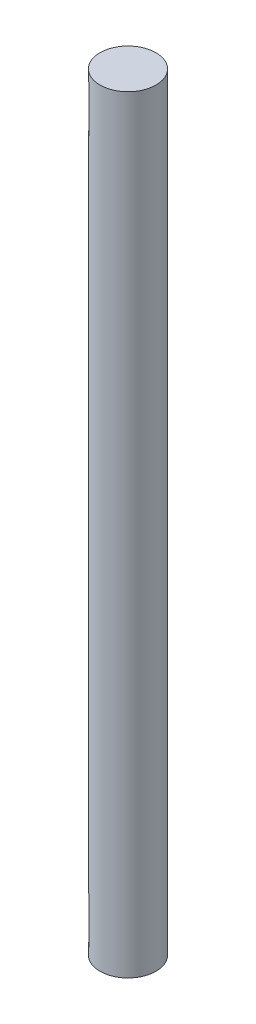
ISO-10303-21;
HEADER;
FILE_DESCRIPTION(('STEP AP214'),'2;1');
FILE_NAME('part.step','',(''),(''),'','','');
FILE_SCHEMA(('AUTOMOTIVE_DESIGN { 1 0 10303 214 1 1 1 1 }'));
ENDSEC;
DATA;
#1=APPLICATION_CONTEXT('core data for automotive mechanical design processes');
#2=APPLICATION_PROTOCOL_DEFINITION('international standard','automotive_design',2000,#1);
#3=PRODUCT_CONTEXT('',#1,'mechanical');
#4=PRODUCT('Part','Part','',(#3));
#5=PRODUCT_RELATED_PRODUCT_CATEGORY('part','',(#4));
#6=PRODUCT_DEFINITION_FORMATION('','',#4);
#7=PRODUCT_DEFINITION_CONTEXT('part definition',#1,'design');
#8=PRODUCT_DEFINITION('design','',#6,#7);
#9=PRODUCT_DEFINITION_SHAPE('','',#8);
#10=(LENGTH_UNIT() NAMED_UNIT(*) SI_UNIT(.MILLI.,.METRE.));
#11=(NAMED_UNIT(*) PLANE_ANGLE_UNIT() SI_UNIT($,.RADIAN.));
#12=(NAMED_UNIT(*) SI_UNIT($,.STERADIAN.) SOLID_ANGLE_UNIT());
#13=UNCERTAINTY_MEASURE_WITH_UNIT(LENGTH_MEASURE(1.E-05),#10,'distance_accuracy_value','');
#14=(GEOMETRIC_REPRESENTATION_CONTEXT(3) GLOBAL_UNCERTAINTY_ASSIGNED_CONTEXT((#13)) GLOBAL_UNIT_ASSIGNED_CONTEXT((#10,
#11,#12)) REPRESENTATION_CONTEXT('',''));
#15=CARTESIAN_POINT('',(0.,0.,0.));
#16=DIRECTION('',(0.,0.,1.));
#17=DIRECTION('',(1.,0.,0.));
#18=AXIS2_PLACEMENT_3D('',#15,#16,#17);
#19=CARTESIAN_POINT('',(0.,68.1,0.));
#20=DIRECTION('',(0.,-1.,0.));
#21=DIRECTION('',(0.,0.,-1.));
#22=AXIS2_PLACEMENT_3D('',#19,#20,#21);
#23=CYLINDRICAL_SURFACE('',#22,2.485);
#24=CARTESIAN_POINT('',(0.,4.95,0.));
#25=DIRECTION('',(0.,1.,0.));
#26=DIRECTION('',(0.,0.,1.));
#27=AXIS2_PLACEMENT_3D('',#24,#25,#26);
#28=CIRCLE('',#27,2.485);
#29=CARTESIAN_POINT('',(-1.435,4.95,-2.02879274446652));
#30=VERTEX_POINT('',#29);
#31=CARTESIAN_POINT('',(-1.43500000000001,4.95,2.02879274446652));
#32=VERTEX_POINT('',#31);
#33=EDGE_CURVE('E74',#30,#32,#28,.T.);
#34=ORIENTED_EDGE('',*,*,#33,.T.);
#35=DIRECTION('',(0.,-1.,0.));
#36=VECTOR('',#35,1.);
#37=CARTESIAN_POINT('',(-1.435,68.1,2.02879274446652));
#38=LINE('',#37,#36);
#39=CARTESIAN_POINT('',(-1.43500000000001,0.789999999999999,2.02879274446652));
#40=VERTEX_POINT('',#39);
#41=EDGE_CURVE('E11',#32,#40,#38,.T.);
#42=ORIENTED_EDGE('',*,*,#41,.T.);
#43=CARTESIAN_POINT('',(0.,0.789999999999999,0.));
#44=DIRECTION('',(0.,-1.,0.));
#45=DIRECTION('',(0.,0.,-1.));
#46=AXIS2_PLACEMENT_3D('',#43,#44,#45);
#47=CIRCLE('',#46,2.485);
#48=CARTESIAN_POINT('',(-1.43500000000001,0.789999999999999,-2.02879274446652));
#49=VERTEX_POINT('',#48);
#50=EDGE_CURVE('E41',#40,#49,#47,.T.);
#51=ORIENTED_EDGE('',*,*,#50,.T.);
#52=DIRECTION('',(0.,-1.,0.));
#53=VECTOR('',#52,1.);
#54=CARTESIAN_POINT('',(-1.435,68.1,-2.02879274446652));
#55=LINE('',#54,#53);
#56=EDGE_CURVE('E77',#49,#30,#55,.F.);
#57=ORIENTED_EDGE('',*,*,#56,.T.);
#58=EDGE_LOOP('',(#34,#42,#51,#57));
#59=FACE_BOUND('',#58,.T.);
#60=DIRECTION('',(0.,-1.,0.));
#61=VECTOR('',#60,1.);
#62=CARTESIAN_POINT('',(-1.43500000000001,68.1,-2.02879274446652));
#63=LINE('',#62,#61);
#64=CARTESIAN_POINT('',(-1.43500000000001,63.15,-2.02879274446652));
#65=VERTEX_POINT('',#64);
#66=CARTESIAN_POINT('',(-1.43500000000001,67.31,-2.02879274446652));
#67=VERTEX_POINT('',#66);
#68=EDGE_CURVE('E101',#65,#67,#63,.F.);
#69=ORIENTED_EDGE('',*,*,#68,.T.);
#70=CARTESIAN_POINT('',(0.,67.31,0.));
#71=DIRECTION('',(0.,1.,0.));
#72=DIRECTION('',(0.,0.,1.));
#73=AXIS2_PLACEMENT_3D('',#70,#71,#72);
#74=CIRCLE('',#73,2.485);
#75=CARTESIAN_POINT('',(-1.43500000000001,67.31,2.02879274446652));
#76=VERTEX_POINT('',#75);
#77=EDGE_CURVE('E107',#67,#76,#74,.T.);
#78=ORIENTED_EDGE('',*,*,#77,.T.);
#79=DIRECTION('',(0.,-1.,0.));
#80=VECTOR('',#79,1.);
#81=CARTESIAN_POINT('',(-1.43500000000001,68.1,2.02879274446652));
#82=LINE('',#81,#80);
#83=CARTESIAN_POINT('',(-1.43500000000001,63.15,2.02879274446652));
#84=VERTEX_POINT('',#83);
#85=EDGE_CURVE('E104',#76,#84,#82,.T.);
#86=ORIENTED_EDGE('',*,*,#85,.T.);
#87=CARTESIAN_POINT('',(0.,63.15,0.));
#88=DIRECTION('',(0.,-1.,0.));
#89=DIRECTION('',(0.,0.,-1.));
#90=AXIS2_PLACEMENT_3D('',#87,#88,#89);
#91=CIRCLE('',#90,2.485);
#92=EDGE_CURVE('E96',#84,#65,#91,.T.);
#93=ORIENTED_EDGE('',*,*,#92,.T.);
#94=EDGE_LOOP('',(#69,#78,#86,#93));
#95=FACE_BOUND('',#94,.T.);
#96=CARTESIAN_POINT('',(0.,68.1,0.));
#97=DIRECTION('',(0.,1.,0.));
#98=DIRECTION('',(0.,0.,1.));
#99=AXIS2_PLACEMENT_3D('',#96,#97,#98);
#100=CIRCLE('',#99,2.485);
#101=CARTESIAN_POINT('',(0.,68.1,2.485));
#102=VERTEX_POINT('',#101);
#103=EDGE_CURVE('E93',#102,#102,#100,.T.);
#104=ORIENTED_EDGE('',*,*,#103,.F.);
#105=EDGE_LOOP('',(#104));
#106=FACE_BOUND('',#105,.T.);
#107=CARTESIAN_POINT('',(0.,0.,0.));
#108=DIRECTION('',(0.,1.,0.));
#109=DIRECTION('',(0.,0.,1.));
#110=AXIS2_PLACEMENT_3D('',#107,#108,#109);
#111=CIRCLE('',#110,2.485);
#112=CARTESIAN_POINT('',(0.,0.,2.485));
#113=VERTEX_POINT('',#112);
#114=EDGE_CURVE('E91',#113,#113,#111,.T.);
#115=ORIENTED_EDGE('',*,*,#114,.T.);
#116=EDGE_LOOP('',(#115));
#117=FACE_BOUND('',#116,.T.);
#118=ADVANCED_FACE('F34',(#59,#95,#106,#117),#23,.T.);
#119=CARTESIAN_POINT('',(0.,68.1,0.));
#120=DIRECTION('',(0.,1.,0.));
#121=DIRECTION('',(0.,0.,1.));
#122=AXIS2_PLACEMENT_3D('',#119,#120,#121);
#123=PLANE('',#122);
#124=ORIENTED_EDGE('',*,*,#103,.T.);
#125=EDGE_LOOP('',(#124));
#126=FACE_BOUND('',#125,.T.);
#127=ADVANCED_FACE('F125',(#126),#123,.T.);
#128=CARTESIAN_POINT('',(0.,0.,0.));
#129=DIRECTION('',(0.,1.,0.));
#130=DIRECTION('',(0.,0.,1.));
#131=AXIS2_PLACEMENT_3D('',#128,#129,#130);
#132=PLANE('',#131);
#133=ORIENTED_EDGE('',*,*,#114,.F.);
#134=EDGE_LOOP('',(#133));
#135=FACE_BOUND('',#134,.T.);
#136=ADVANCED_FACE('F129',(#135),#132,.F.);
#137=CARTESIAN_POINT('',(-2.48500000000001,67.31,-2.485));
#138=DIRECTION('',(0.,1.,0.));
#139=DIRECTION('',(0.,0.,1.));
#140=AXIS2_PLACEMENT_3D('',#137,#138,#139);
#141=PLANE('',#140);
#142=DIRECTION('',(0.,0.,1.));
#143=VECTOR('',#142,1.);
#144=CARTESIAN_POINT('',(-1.43500000000001,67.31,-2.485));
#145=LINE('',#144,#143);
#146=EDGE_CURVE('E86',#67,#76,#145,.T.);
#147=ORIENTED_EDGE('',*,*,#146,.T.);
#148=ORIENTED_EDGE('',*,*,#77,.F.);
#149=EDGE_LOOP('',(#147,#148));
#150=FACE_BOUND('',#149,.T.);
#151=ADVANCED_FACE('F135',(#150),#141,.F.);
#152=CARTESIAN_POINT('',(-1.43500000000001,67.31,-2.485));
#153=DIRECTION('',(1.,0.,0.));
#154=DIRECTION('',(0.,1.,0.));
#155=AXIS2_PLACEMENT_3D('',#152,#153,#154);
#156=PLANE('',#155);
#157=ORIENTED_EDGE('',*,*,#146,.F.);
#158=ORIENTED_EDGE('',*,*,#68,.F.);
#159=DIRECTION('',(0.,0.,1.));
#160=VECTOR('',#159,1.);
#161=CARTESIAN_POINT('',(-1.43500000000001,63.15,-2.485));
#162=LINE('',#161,#160);
#163=EDGE_CURVE('E55',#65,#84,#162,.T.);
#164=ORIENTED_EDGE('',*,*,#163,.T.);
#165=ORIENTED_EDGE('',*,*,#85,.F.);
#166=EDGE_LOOP('',(#157,#158,#164,#165));
#167=FACE_BOUND('',#166,.T.);
#168=ADVANCED_FACE('F120',(#167),#156,.F.);
#169=CARTESIAN_POINT('',(-2.48500000000001,63.15,-2.485));
#170=DIRECTION('',(0.,-1.,0.));
#171=DIRECTION('',(0.,0.,-1.));
#172=AXIS2_PLACEMENT_3D('',#169,#170,#171);
#173=PLANE('',#172);
#174=ORIENTED_EDGE('',*,*,#163,.F.);
#175=ORIENTED_EDGE('',*,*,#92,.F.);
#176=EDGE_LOOP('',(#174,#175));
#177=FACE_BOUND('',#176,.T.);
#178=ADVANCED_FACE('F113',(#177),#173,.F.);
#179=CARTESIAN_POINT('',(-2.48500000000001,0.789999999999999,-2.485));
#180=DIRECTION('',(0.,-1.,0.));
#181=DIRECTION('',(0.,0.,-1.));
#182=AXIS2_PLACEMENT_3D('',#179,#180,#181);
#183=PLANE('',#182);
#184=DIRECTION('',(0.,0.,1.));
#185=VECTOR('',#184,1.);
#186=CARTESIAN_POINT('',(-1.43500000000001,0.789999999999999,-2.485));
#187=LINE('',#186,#185);
#188=EDGE_CURVE('E83',#49,#40,#187,.T.);
#189=ORIENTED_EDGE('',*,*,#188,.F.);
#190=ORIENTED_EDGE('',*,*,#50,.F.);
#191=EDGE_LOOP('',(#189,#190));
#192=FACE_BOUND('',#191,.T.);
#193=ADVANCED_FACE('F111',(#192),#183,.F.);
#194=CARTESIAN_POINT('',(-2.48500000000001,4.95,-2.485));
#195=DIRECTION('',(0.,1.,0.));
#196=DIRECTION('',(0.,0.,1.));
#197=AXIS2_PLACEMENT_3D('',#194,#195,#196);
#198=PLANE('',#197);
#199=DIRECTION('',(0.,0.,1.));
#200=VECTOR('',#199,1.);
#201=CARTESIAN_POINT('',(-1.43500000000001,4.95,-2.485));
#202=LINE('',#201,#200);
#203=EDGE_CURVE('E48',#30,#32,#202,.T.);
#204=ORIENTED_EDGE('',*,*,#203,.T.);
#205=ORIENTED_EDGE('',*,*,#33,.F.);
#206=EDGE_LOOP('',(#204,#205));
#207=FACE_BOUND('',#206,.T.);
#208=ADVANCED_FACE('F84',(#207),#198,.F.);
#209=CARTESIAN_POINT('',(-1.43500000000001,0.789999999999999,-2.485));
#210=DIRECTION('',(1.,0.,0.));
#211=DIRECTION('',(0.,1.,0.));
#212=AXIS2_PLACEMENT_3D('',#209,#210,#211);
#213=PLANE('',#212);
#214=ORIENTED_EDGE('',*,*,#203,.F.);
#215=ORIENTED_EDGE('',*,*,#56,.F.);
#216=ORIENTED_EDGE('',*,*,#188,.T.);
#217=ORIENTED_EDGE('',*,*,#41,.F.);
#218=EDGE_LOOP('',(#214,#215,#216,#217));
#219=FACE_BOUND('',#218,.T.);
#220=ADVANCED_FACE('F81',(#219),#213,.F.);
#221=CLOSED_SHELL('',(#118,#127,#136,#151,#168,#178,#193,#208,#220));
#222=MANIFOLD_SOLID_BREP('B2',#221);
#223=ADVANCED_BREP_SHAPE_REPRESENTATION('',(#18,#222),#14);
#224=SHAPE_DEFINITION_REPRESENTATION(#9,#223);
ENDSEC;
END-ISO-10303-21;
